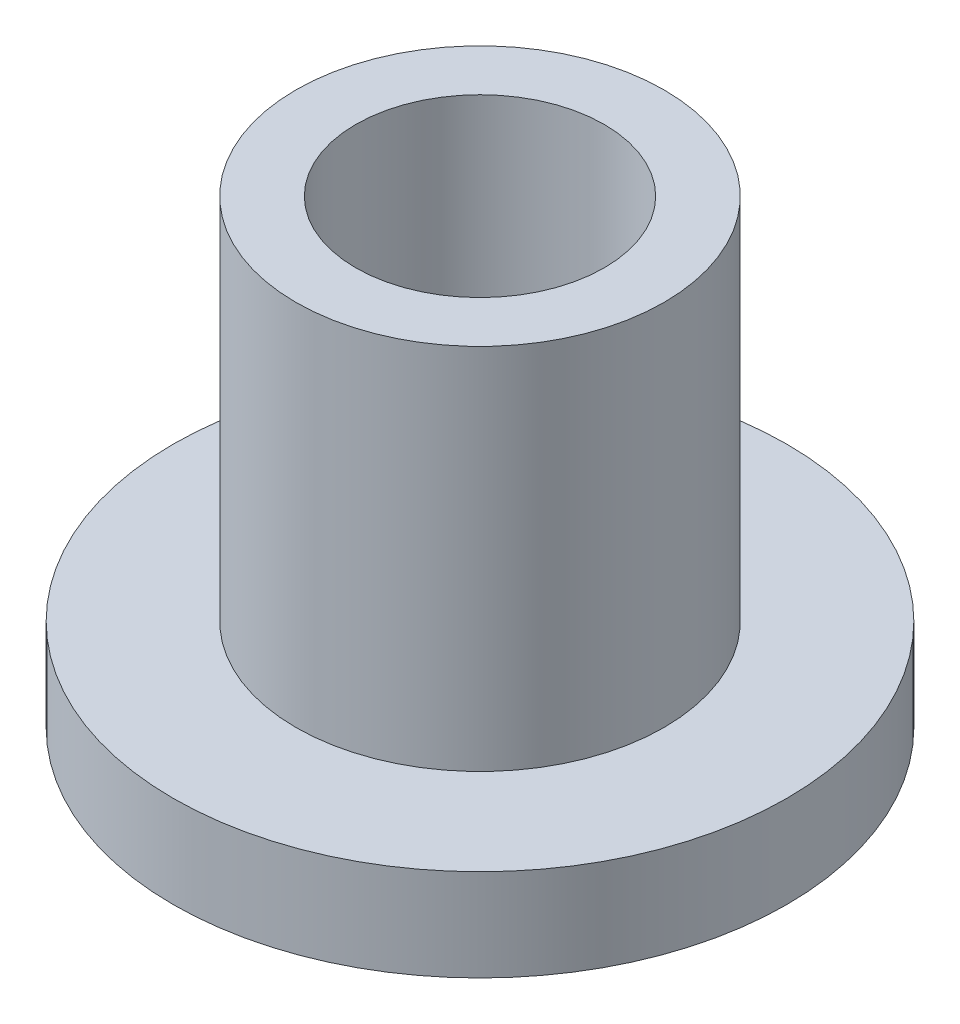
ISO-10303-21;
HEADER;
FILE_DESCRIPTION(('STEP AP214'),'2;1');
FILE_NAME('part.step','',(''),(''),'','','');
FILE_SCHEMA(('AUTOMOTIVE_DESIGN { 1 0 10303 214 1 1 1 1 }'));
ENDSEC;
DATA;
#1=APPLICATION_CONTEXT('core data for automotive mechanical design processes');
#2=APPLICATION_PROTOCOL_DEFINITION('international standard','automotive_design',2000,#1);
#3=PRODUCT_CONTEXT('',#1,'mechanical');
#4=PRODUCT('Part','Part','',(#3));
#5=PRODUCT_RELATED_PRODUCT_CATEGORY('part','',(#4));
#6=PRODUCT_DEFINITION_FORMATION('','',#4);
#7=PRODUCT_DEFINITION_CONTEXT('part definition',#1,'design');
#8=PRODUCT_DEFINITION('design','',#6,#7);
#9=PRODUCT_DEFINITION_SHAPE('','',#8);
#10=(LENGTH_UNIT() NAMED_UNIT(*) SI_UNIT(.MILLI.,.METRE.));
#11=(NAMED_UNIT(*) PLANE_ANGLE_UNIT() SI_UNIT($,.RADIAN.));
#12=(NAMED_UNIT(*) SI_UNIT($,.STERADIAN.) SOLID_ANGLE_UNIT());
#13=UNCERTAINTY_MEASURE_WITH_UNIT(LENGTH_MEASURE(1.E-05),#10,'distance_accuracy_value','');
#14=(GEOMETRIC_REPRESENTATION_CONTEXT(3) GLOBAL_UNCERTAINTY_ASSIGNED_CONTEXT((#13)) GLOBAL_UNIT_ASSIGNED_CONTEXT((#10,
#11,#12)) REPRESENTATION_CONTEXT('',''));
#15=CARTESIAN_POINT('',(0.,0.,0.));
#16=DIRECTION('',(0.,0.,1.));
#17=DIRECTION('',(1.,0.,0.));
#18=AXIS2_PLACEMENT_3D('',#15,#16,#17);
#19=CARTESIAN_POINT('',(0.,3.,0.));
#20=DIRECTION('',(0.,-1.,0.));
#21=DIRECTION('',(0.,0.,-1.));
#22=AXIS2_PLACEMENT_3D('',#19,#20,#21);
#23=CYLINDRICAL_SURFACE('',#22,10.);
#24=CARTESIAN_POINT('',(0.,3.,0.));
#25=DIRECTION('',(0.,1.,0.));
#26=DIRECTION('',(0.,0.,1.));
#27=AXIS2_PLACEMENT_3D('',#24,#25,#26);
#28=CIRCLE('',#27,10.);
#29=CARTESIAN_POINT('',(0.,3.,10.));
#30=VERTEX_POINT('',#29);
#31=EDGE_CURVE('E51',#30,#30,#28,.T.);
#32=ORIENTED_EDGE('',*,*,#31,.F.);
#33=EDGE_LOOP('',(#32));
#34=FACE_BOUND('',#33,.T.);
#35=CARTESIAN_POINT('',(0.,0.,0.));
#36=DIRECTION('',(0.,1.,0.));
#37=DIRECTION('',(0.,0.,1.));
#38=AXIS2_PLACEMENT_3D('',#35,#36,#37);
#39=CIRCLE('',#38,10.);
#40=CARTESIAN_POINT('',(0.,0.,10.));
#41=VERTEX_POINT('',#40);
#42=EDGE_CURVE('E46',#41,#41,#39,.T.);
#43=ORIENTED_EDGE('',*,*,#42,.T.);
#44=EDGE_LOOP('',(#43));
#45=FACE_BOUND('',#44,.T.);
#46=ADVANCED_FACE('F43',(#34,#45),#23,.T.);
#47=CARTESIAN_POINT('',(0.,3.,0.));
#48=DIRECTION('',(0.,1.,0.));
#49=DIRECTION('',(0.,0.,1.));
#50=AXIS2_PLACEMENT_3D('',#47,#48,#49);
#51=PLANE('',#50);
#52=CARTESIAN_POINT('',(0.,3.,0.));
#53=DIRECTION('',(0.,1.,0.));
#54=DIRECTION('',(0.,0.,1.));
#55=AXIS2_PLACEMENT_3D('',#52,#53,#54);
#56=CIRCLE('',#55,6.);
#57=CARTESIAN_POINT('',(0.,3.,6.));
#58=VERTEX_POINT('',#57);
#59=EDGE_CURVE('E10',#58,#58,#56,.T.);
#60=ORIENTED_EDGE('',*,*,#59,.F.);
#61=EDGE_LOOP('',(#60));
#62=FACE_BOUND('',#61,.T.);
#63=ORIENTED_EDGE('',*,*,#31,.T.);
#64=EDGE_LOOP('',(#63));
#65=FACE_BOUND('',#64,.T.);
#66=ADVANCED_FACE('F93',(#62,#65),#51,.T.);
#67=CARTESIAN_POINT('',(0.,0.,0.));
#68=DIRECTION('',(0.,1.,0.));
#69=DIRECTION('',(0.,0.,1.));
#70=AXIS2_PLACEMENT_3D('',#67,#68,#69);
#71=PLANE('',#70);
#72=CARTESIAN_POINT('',(0.,0.,0.));
#73=DIRECTION('',(0.,1.,0.));
#74=DIRECTION('',(0.,0.,1.));
#75=AXIS2_PLACEMENT_3D('',#72,#73,#74);
#76=CIRCLE('',#75,4.05);
#77=CARTESIAN_POINT('',(0.,0.,4.05));
#78=VERTEX_POINT('',#77);
#79=EDGE_CURVE('E62',#78,#78,#76,.T.);
#80=ORIENTED_EDGE('',*,*,#79,.T.);
#81=EDGE_LOOP('',(#80));
#82=FACE_BOUND('',#81,.T.);
#83=ORIENTED_EDGE('',*,*,#42,.F.);
#84=EDGE_LOOP('',(#83));
#85=FACE_BOUND('',#84,.T.);
#86=ADVANCED_FACE('F71',(#82,#85),#71,.F.);
#87=CARTESIAN_POINT('',(0.,15.,0.));
#88=DIRECTION('',(0.,-1.,0.));
#89=DIRECTION('',(0.,0.,-1.));
#90=AXIS2_PLACEMENT_3D('',#87,#88,#89);
#91=CYLINDRICAL_SURFACE('',#90,6.);
#92=CARTESIAN_POINT('',(0.,15.,0.));
#93=DIRECTION('',(0.,1.,0.));
#94=DIRECTION('',(0.,0.,1.));
#95=AXIS2_PLACEMENT_3D('',#92,#93,#94);
#96=CIRCLE('',#95,6.);
#97=CARTESIAN_POINT('',(0.,15.,6.));
#98=VERTEX_POINT('',#97);
#99=EDGE_CURVE('E58',#98,#98,#96,.T.);
#100=ORIENTED_EDGE('',*,*,#99,.F.);
#101=EDGE_LOOP('',(#100));
#102=FACE_BOUND('',#101,.T.);
#103=ORIENTED_EDGE('',*,*,#59,.T.);
#104=EDGE_LOOP('',(#103));
#105=FACE_BOUND('',#104,.T.);
#106=ADVANCED_FACE('F83',(#102,#105),#91,.T.);
#107=CARTESIAN_POINT('',(0.,15.,0.));
#108=DIRECTION('',(0.,1.,0.));
#109=DIRECTION('',(0.,0.,1.));
#110=AXIS2_PLACEMENT_3D('',#107,#108,#109);
#111=PLANE('',#110);
#112=CARTESIAN_POINT('',(0.,15.,0.));
#113=DIRECTION('',(0.,1.,0.));
#114=DIRECTION('',(0.,0.,1.));
#115=AXIS2_PLACEMENT_3D('',#112,#113,#114);
#116=CIRCLE('',#115,4.05);
#117=CARTESIAN_POINT('',(0.,15.,4.05));
#118=VERTEX_POINT('',#117);
#119=EDGE_CURVE('E63',#118,#118,#116,.T.);
#120=ORIENTED_EDGE('',*,*,#119,.F.);
#121=EDGE_LOOP('',(#120));
#122=FACE_BOUND('',#121,.T.);
#123=ORIENTED_EDGE('',*,*,#99,.T.);
#124=EDGE_LOOP('',(#123));
#125=FACE_BOUND('',#124,.T.);
#126=ADVANCED_FACE('F77',(#122,#125),#111,.T.);
#127=CARTESIAN_POINT('',(0.,0.,0.));
#128=DIRECTION('',(0.,1.,0.));
#129=DIRECTION('',(0.,0.,1.));
#130=AXIS2_PLACEMENT_3D('',#127,#128,#129);
#131=CYLINDRICAL_SURFACE('',#130,4.05);
#132=ORIENTED_EDGE('',*,*,#79,.F.);
#133=EDGE_LOOP('',(#132));
#134=FACE_BOUND('',#133,.T.);
#135=ORIENTED_EDGE('',*,*,#119,.T.);
#136=EDGE_LOOP('',(#135));
#137=FACE_BOUND('',#136,.T.);
#138=ADVANCED_FACE('F74',(#134,#137),#131,.F.);
#139=CLOSED_SHELL('',(#46,#66,#86,#106,#126,#138));
#140=MANIFOLD_SOLID_BREP('B2',#139);
#141=ADVANCED_BREP_SHAPE_REPRESENTATION('',(#18,#140),#14);
#142=SHAPE_DEFINITION_REPRESENTATION(#9,#141);
ENDSEC;
END-ISO-10303-21;
